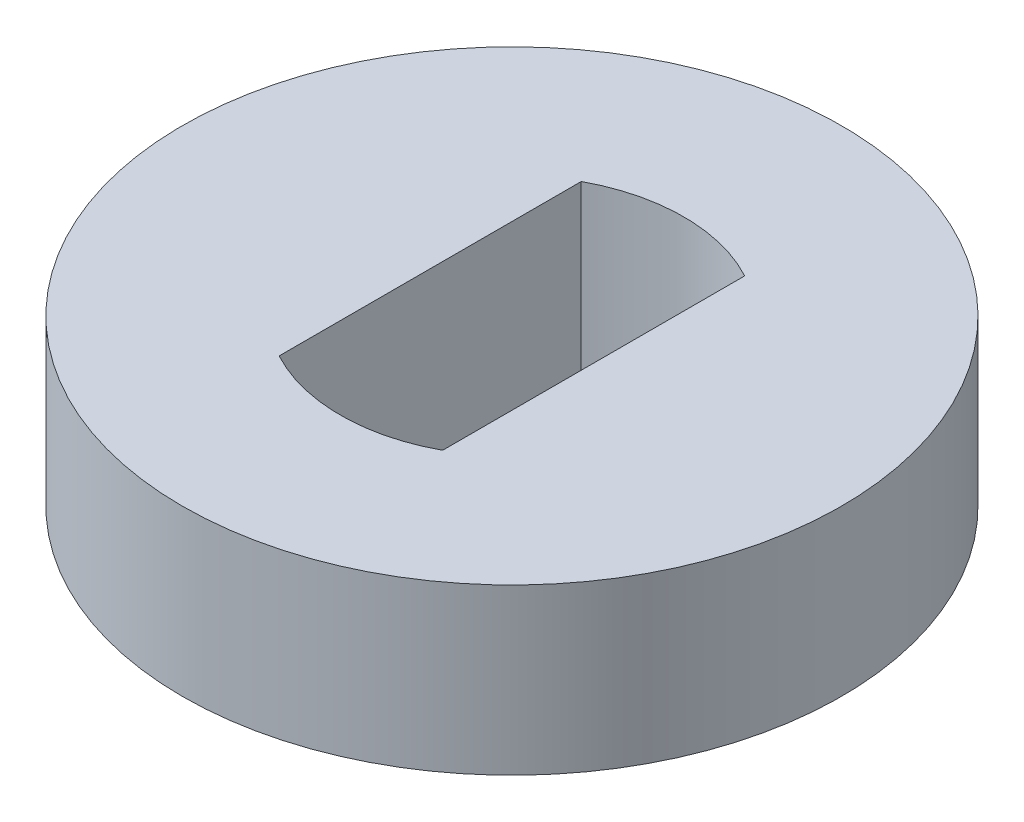
ISO-10303-21;
HEADER;
FILE_DESCRIPTION(('STEP AP214'),'2;1');
FILE_NAME('part.step','',(''),(''),'','','');
FILE_SCHEMA(('AUTOMOTIVE_DESIGN { 1 0 10303 214 1 1 1 1 }'));
ENDSEC;
DATA;
#1=APPLICATION_CONTEXT('core data for automotive mechanical design processes');
#2=APPLICATION_PROTOCOL_DEFINITION('international standard','automotive_design',2000,#1);
#3=PRODUCT_CONTEXT('',#1,'mechanical');
#4=PRODUCT('Part','Part','',(#3));
#5=PRODUCT_RELATED_PRODUCT_CATEGORY('part','',(#4));
#6=PRODUCT_DEFINITION_FORMATION('','',#4);
#7=PRODUCT_DEFINITION_CONTEXT('part definition',#1,'design');
#8=PRODUCT_DEFINITION('design','',#6,#7);
#9=PRODUCT_DEFINITION_SHAPE('','',#8);
#10=(LENGTH_UNIT() NAMED_UNIT(*) SI_UNIT(.MILLI.,.METRE.));
#11=(NAMED_UNIT(*) PLANE_ANGLE_UNIT() SI_UNIT($,.RADIAN.));
#12=(NAMED_UNIT(*) SI_UNIT($,.STERADIAN.) SOLID_ANGLE_UNIT());
#13=UNCERTAINTY_MEASURE_WITH_UNIT(LENGTH_MEASURE(1.E-05),#10,'distance_accuracy_value','');
#14=(GEOMETRIC_REPRESENTATION_CONTEXT(3) GLOBAL_UNCERTAINTY_ASSIGNED_CONTEXT((#13)) GLOBAL_UNIT_ASSIGNED_CONTEXT((#10,
#11,#12)) REPRESENTATION_CONTEXT('',''));
#15=CARTESIAN_POINT('',(0.,0.,0.));
#16=DIRECTION('',(0.,0.,1.));
#17=DIRECTION('',(1.,0.,0.));
#18=AXIS2_PLACEMENT_3D('',#15,#16,#17);
#19=CARTESIAN_POINT('',(0.,3.,0.));
#20=DIRECTION('',(0.,1.,0.));
#21=DIRECTION('',(0.,0.,1.));
#22=AXIS2_PLACEMENT_3D('',#19,#20,#21);
#23=PLANE('',#22);
#24=CARTESIAN_POINT('',(0.,3.,0.));
#25=DIRECTION('',(0.,1.,0.));
#26=DIRECTION('',(0.,0.,1.));
#27=AXIS2_PLACEMENT_3D('',#24,#25,#26);
#28=CIRCLE('',#27,6.);
#29=CARTESIAN_POINT('',(0.,3.,6.));
#30=VERTEX_POINT('',#29);
#31=EDGE_CURVE('E11',#30,#30,#28,.T.);
#32=ORIENTED_EDGE('',*,*,#31,.T.);
#33=EDGE_LOOP('',(#32));
#34=FACE_BOUND('',#33,.T.);
#35=DIRECTION('',(0.,0.,-1.));
#36=VECTOR('',#35,1.);
#37=CARTESIAN_POINT('',(1.4881529155133,3.,2.75));
#38=LINE('',#37,#36);
#39=CARTESIAN_POINT('',(1.4881529155133,3.,2.75));
#40=VERTEX_POINT('',#39);
#41=CARTESIAN_POINT('',(1.4881529155133,3.,-2.75));
#42=VERTEX_POINT('',#41);
#43=EDGE_CURVE('E81',#40,#42,#38,.T.);
#44=ORIENTED_EDGE('',*,*,#43,.F.);
#45=CARTESIAN_POINT('',(0.,3.,0.));
#46=DIRECTION('',(0.,1.,0.));
#47=DIRECTION('',(0.,0.,1.));
#48=AXIS2_PLACEMENT_3D('',#45,#46,#47);
#49=CIRCLE('',#48,3.12683531704993);
#50=CARTESIAN_POINT('',(-1.4881529155133,3.,2.75));
#51=VERTEX_POINT('',#50);
#52=EDGE_CURVE('E73',#51,#40,#49,.T.);
#53=ORIENTED_EDGE('',*,*,#52,.F.);
#54=DIRECTION('',(0.,0.,1.));
#55=VECTOR('',#54,1.);
#56=CARTESIAN_POINT('',(-1.4881529155133,3.,2.75));
#57=LINE('',#56,#55);
#58=CARTESIAN_POINT('',(-1.4881529155133,3.,-2.75));
#59=VERTEX_POINT('',#58);
#60=EDGE_CURVE('E94',#59,#51,#57,.T.);
#61=ORIENTED_EDGE('',*,*,#60,.F.);
#62=CARTESIAN_POINT('',(0.,3.,0.));
#63=DIRECTION('',(0.,1.,0.));
#64=DIRECTION('',(0.,0.,1.));
#65=AXIS2_PLACEMENT_3D('',#62,#63,#64);
#66=CIRCLE('',#65,3.12683531704993);
#67=EDGE_CURVE('E92',#42,#59,#66,.T.);
#68=ORIENTED_EDGE('',*,*,#67,.F.);
#69=EDGE_LOOP('',(#44,#53,#61,#68));
#70=FACE_BOUND('',#69,.T.);
#71=ADVANCED_FACE('F32',(#34,#70),#23,.T.);
#72=CARTESIAN_POINT('',(0.,0.,0.));
#73=DIRECTION('',(0.,1.,0.));
#74=DIRECTION('',(0.,0.,1.));
#75=AXIS2_PLACEMENT_3D('',#72,#73,#74);
#76=PLANE('',#75);
#77=CARTESIAN_POINT('',(0.,0.,0.));
#78=DIRECTION('',(0.,1.,0.));
#79=DIRECTION('',(0.,0.,1.));
#80=AXIS2_PLACEMENT_3D('',#77,#78,#79);
#81=CIRCLE('',#80,6.);
#82=CARTESIAN_POINT('',(0.,0.,6.));
#83=VERTEX_POINT('',#82);
#84=EDGE_CURVE('E36',#83,#83,#81,.T.);
#85=ORIENTED_EDGE('',*,*,#84,.F.);
#86=EDGE_LOOP('',(#85));
#87=FACE_BOUND('',#86,.T.);
#88=CARTESIAN_POINT('',(0.,0.,0.));
#89=DIRECTION('',(0.,1.,0.));
#90=DIRECTION('',(0.,0.,1.));
#91=AXIS2_PLACEMENT_3D('',#88,#89,#90);
#92=CIRCLE('',#91,3.12683531704993);
#93=CARTESIAN_POINT('',(-1.4881529155133,0.,2.75));
#94=VERTEX_POINT('',#93);
#95=CARTESIAN_POINT('',(1.4881529155133,0.,2.75));
#96=VERTEX_POINT('',#95);
#97=EDGE_CURVE('E55',#94,#96,#92,.T.);
#98=ORIENTED_EDGE('',*,*,#97,.T.);
#99=DIRECTION('',(0.,0.,-1.));
#100=VECTOR('',#99,1.);
#101=CARTESIAN_POINT('',(1.4881529155133,0.,2.75));
#102=LINE('',#101,#100);
#103=CARTESIAN_POINT('',(1.4881529155133,0.,-2.75));
#104=VERTEX_POINT('',#103);
#105=EDGE_CURVE('E88',#96,#104,#102,.T.);
#106=ORIENTED_EDGE('',*,*,#105,.T.);
#107=CARTESIAN_POINT('',(0.,0.,0.));
#108=DIRECTION('',(0.,1.,0.));
#109=DIRECTION('',(0.,0.,1.));
#110=AXIS2_PLACEMENT_3D('',#107,#108,#109);
#111=CIRCLE('',#110,3.12683531704993);
#112=CARTESIAN_POINT('',(-1.4881529155133,0.,-2.75));
#113=VERTEX_POINT('',#112);
#114=EDGE_CURVE('E100',#104,#113,#111,.T.);
#115=ORIENTED_EDGE('',*,*,#114,.T.);
#116=DIRECTION('',(0.,0.,1.));
#117=VECTOR('',#116,1.);
#118=CARTESIAN_POINT('',(-1.4881529155133,0.,2.75));
#119=LINE('',#118,#117);
#120=EDGE_CURVE('E82',#113,#94,#119,.T.);
#121=ORIENTED_EDGE('',*,*,#120,.T.);
#122=EDGE_LOOP('',(#98,#106,#115,#121));
#123=FACE_BOUND('',#122,.T.);
#124=ADVANCED_FACE('F111',(#87,#123),#76,.F.);
#125=CARTESIAN_POINT('',(0.,3.,0.));
#126=DIRECTION('',(0.,-1.,0.));
#127=DIRECTION('',(0.,0.,-1.));
#128=AXIS2_PLACEMENT_3D('',#125,#126,#127);
#129=CYLINDRICAL_SURFACE('',#128,6.);
#130=ORIENTED_EDGE('',*,*,#31,.F.);
#131=EDGE_LOOP('',(#130));
#132=FACE_BOUND('',#131,.T.);
#133=ORIENTED_EDGE('',*,*,#84,.T.);
#134=EDGE_LOOP('',(#133));
#135=FACE_BOUND('',#134,.T.);
#136=ADVANCED_FACE('F34',(#132,#135),#129,.T.);
#137=CARTESIAN_POINT('',(0.,3.,0.));
#138=DIRECTION('',(0.,-1.,0.));
#139=DIRECTION('',(0.,0.,-1.));
#140=AXIS2_PLACEMENT_3D('',#137,#138,#139);
#141=CYLINDRICAL_SURFACE('',#140,3.12683531704993);
#142=ORIENTED_EDGE('',*,*,#97,.F.);
#143=DIRECTION('',(0.,-1.,0.));
#144=VECTOR('',#143,1.);
#145=CARTESIAN_POINT('',(-1.4881529155133,3.,2.75));
#146=LINE('',#145,#144);
#147=EDGE_CURVE('E77',#51,#94,#146,.T.);
#148=ORIENTED_EDGE('',*,*,#147,.F.);
#149=ORIENTED_EDGE('',*,*,#52,.T.);
#150=DIRECTION('',(0.,-1.,0.));
#151=VECTOR('',#150,1.);
#152=CARTESIAN_POINT('',(1.4881529155133,3.,2.75));
#153=LINE('',#152,#151);
#154=EDGE_CURVE('E76',#40,#96,#153,.T.);
#155=ORIENTED_EDGE('',*,*,#154,.T.);
#156=EDGE_LOOP('',(#142,#148,#149,#155));
#157=FACE_BOUND('',#156,.T.);
#158=ADVANCED_FACE('F75',(#157),#141,.F.);
#159=CARTESIAN_POINT('',(1.4881529155133,3.,2.75));
#160=DIRECTION('',(-1.,0.,0.));
#161=DIRECTION('',(0.,0.,1.));
#162=AXIS2_PLACEMENT_3D('',#159,#160,#161);
#163=PLANE('',#162);
#164=ORIENTED_EDGE('',*,*,#105,.F.);
#165=ORIENTED_EDGE('',*,*,#154,.F.);
#166=ORIENTED_EDGE('',*,*,#43,.T.);
#167=DIRECTION('',(0.,-1.,0.));
#168=VECTOR('',#167,1.);
#169=CARTESIAN_POINT('',(1.4881529155133,3.,-2.75));
#170=LINE('',#169,#168);
#171=EDGE_CURVE('E89',#42,#104,#170,.T.);
#172=ORIENTED_EDGE('',*,*,#171,.T.);
#173=EDGE_LOOP('',(#164,#165,#166,#172));
#174=FACE_BOUND('',#173,.T.);
#175=ADVANCED_FACE('F85',(#174),#163,.T.);
#176=CARTESIAN_POINT('',(0.,3.,0.));
#177=DIRECTION('',(0.,-1.,0.));
#178=DIRECTION('',(0.,0.,-1.));
#179=AXIS2_PLACEMENT_3D('',#176,#177,#178);
#180=CYLINDRICAL_SURFACE('',#179,3.12683531704993);
#181=ORIENTED_EDGE('',*,*,#114,.F.);
#182=ORIENTED_EDGE('',*,*,#171,.F.);
#183=ORIENTED_EDGE('',*,*,#67,.T.);
#184=DIRECTION('',(0.,-1.,0.));
#185=VECTOR('',#184,1.);
#186=CARTESIAN_POINT('',(-1.4881529155133,3.,-2.75));
#187=LINE('',#186,#185);
#188=EDGE_CURVE('E47',#59,#113,#187,.T.);
#189=ORIENTED_EDGE('',*,*,#188,.T.);
#190=EDGE_LOOP('',(#181,#182,#183,#189));
#191=FACE_BOUND('',#190,.T.);
#192=ADVANCED_FACE('F109',(#191),#180,.F.);
#193=CARTESIAN_POINT('',(-1.4881529155133,3.,2.75));
#194=DIRECTION('',(1.,0.,0.));
#195=DIRECTION('',(0.,0.,-1.));
#196=AXIS2_PLACEMENT_3D('',#193,#194,#195);
#197=PLANE('',#196);
#198=ORIENTED_EDGE('',*,*,#120,.F.);
#199=ORIENTED_EDGE('',*,*,#188,.F.);
#200=ORIENTED_EDGE('',*,*,#60,.T.);
#201=ORIENTED_EDGE('',*,*,#147,.T.);
#202=EDGE_LOOP('',(#198,#199,#200,#201));
#203=FACE_BOUND('',#202,.T.);
#204=ADVANCED_FACE('F112',(#203),#197,.T.);
#205=CLOSED_SHELL('',(#71,#124,#136,#158,#175,#192,#204));
#206=MANIFOLD_SOLID_BREP('B2',#205);
#207=ADVANCED_BREP_SHAPE_REPRESENTATION('',(#18,#206),#14);
#208=SHAPE_DEFINITION_REPRESENTATION(#9,#207);
ENDSEC;
END-ISO-10303-21;
